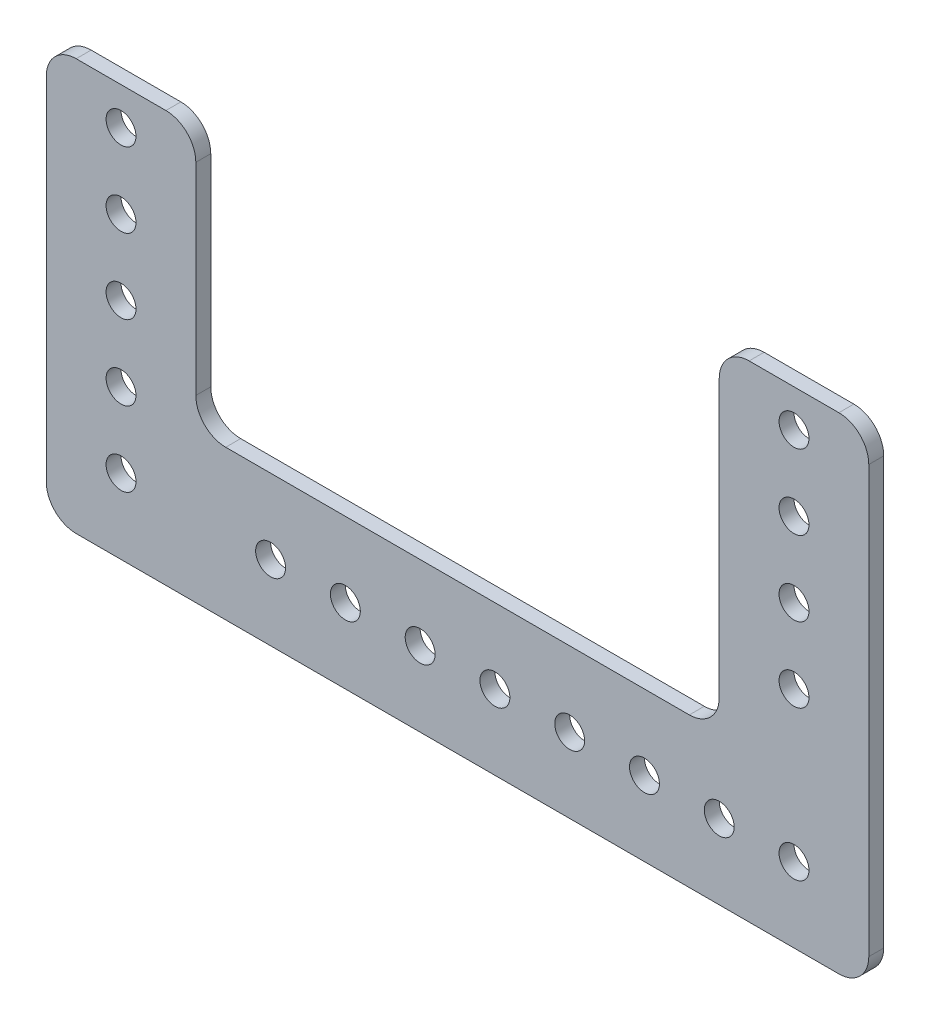
ISO-10303-21;
HEADER;
FILE_DESCRIPTION(('STEP AP214'),'2;1');
FILE_NAME('part.step','',(''),(''),'','','');
FILE_SCHEMA(('AUTOMOTIVE_DESIGN { 1 0 10303 214 1 1 1 1 }'));
ENDSEC;
DATA;
#1=APPLICATION_CONTEXT('core data for automotive mechanical design processes');
#2=APPLICATION_PROTOCOL_DEFINITION('international standard','automotive_design',2000,#1);
#3=PRODUCT_CONTEXT('',#1,'mechanical');
#4=PRODUCT('Part','Part','',(#3));
#5=PRODUCT_RELATED_PRODUCT_CATEGORY('part','',(#4));
#6=PRODUCT_DEFINITION_FORMATION('','',#4);
#7=PRODUCT_DEFINITION_CONTEXT('part definition',#1,'design');
#8=PRODUCT_DEFINITION('design','',#6,#7);
#9=PRODUCT_DEFINITION_SHAPE('','',#8);
#10=(LENGTH_UNIT() NAMED_UNIT(*) SI_UNIT(.MILLI.,.METRE.));
#11=(NAMED_UNIT(*) PLANE_ANGLE_UNIT() SI_UNIT($,.RADIAN.));
#12=(NAMED_UNIT(*) SI_UNIT($,.STERADIAN.) SOLID_ANGLE_UNIT());
#13=UNCERTAINTY_MEASURE_WITH_UNIT(LENGTH_MEASURE(1.E-05),#10,'distance_accuracy_value','');
#14=(GEOMETRIC_REPRESENTATION_CONTEXT(3) GLOBAL_UNCERTAINTY_ASSIGNED_CONTEXT((#13)) GLOBAL_UNIT_ASSIGNED_CONTEXT((#10,
#11,#12)) REPRESENTATION_CONTEXT('',''));
#15=CARTESIAN_POINT('',(0.,0.,0.));
#16=DIRECTION('',(0.,0.,1.));
#17=DIRECTION('',(1.,0.,0.));
#18=AXIS2_PLACEMENT_3D('',#15,#16,#17);
#19=CARTESIAN_POINT('',(452.12,62.23,2.54));
#20=DIRECTION('',(0.,0.,-1.));
#21=DIRECTION('',(-1.,0.,0.));
#22=AXIS2_PLACEMENT_3D('',#19,#20,#21);
#23=PLANE('',#22);
#24=DIRECTION('',(0.,1.,0.));
#25=VECTOR('',#24,1.);
#26=CARTESIAN_POINT('',(457.2,82.55,2.54));
#27=LINE('',#26,#25);
#28=CARTESIAN_POINT('',(457.2,62.23,2.54));
#29=VERTEX_POINT('',#28);
#30=CARTESIAN_POINT('',(457.2,134.62,2.54));
#31=VERTEX_POINT('',#30);
#32=EDGE_CURVE('E116',#29,#31,#27,.T.);
#33=ORIENTED_EDGE('',*,*,#32,.T.);
#34=CARTESIAN_POINT('',(452.12,134.62,2.54));
#35=DIRECTION('',(0.,0.,1.));
#36=DIRECTION('',(-1.,0.,0.));
#37=AXIS2_PLACEMENT_3D('',#34,#35,#36);
#38=CIRCLE('',#37,5.07999999999999);
#39=CARTESIAN_POINT('',(452.12,139.7,2.54));
#40=VERTEX_POINT('',#39);
#41=EDGE_CURVE('E297',#31,#40,#38,.T.);
#42=ORIENTED_EDGE('',*,*,#41,.T.);
#43=DIRECTION('',(-1.,0.,0.));
#44=VECTOR('',#43,1.);
#45=CARTESIAN_POINT('',(436.88,139.7,2.54));
#46=LINE('',#45,#44);
#47=CARTESIAN_POINT('',(436.88,139.7,2.54));
#48=VERTEX_POINT('',#47);
#49=EDGE_CURVE('E248',#40,#48,#46,.T.);
#50=ORIENTED_EDGE('',*,*,#49,.T.);
#51=CARTESIAN_POINT('',(436.88,134.62,2.54));
#52=DIRECTION('',(0.,0.,1.));
#53=DIRECTION('',(-1.,0.,0.));
#54=AXIS2_PLACEMENT_3D('',#51,#52,#53);
#55=CIRCLE('',#54,5.07999999999999);
#56=CARTESIAN_POINT('',(431.8,134.62,2.54));
#57=VERTEX_POINT('',#56);
#58=EDGE_CURVE('E267',#48,#57,#55,.T.);
#59=ORIENTED_EDGE('',*,*,#58,.T.);
#60=DIRECTION('',(0.,-1.,0.));
#61=VECTOR('',#60,1.);
#62=CARTESIAN_POINT('',(431.8,87.6300000000001,2.54));
#63=LINE('',#62,#61);
#64=CARTESIAN_POINT('',(431.8,87.6300000000001,2.54));
#65=VERTEX_POINT('',#64);
#66=EDGE_CURVE('E264',#57,#65,#63,.T.);
#67=ORIENTED_EDGE('',*,*,#66,.T.);
#68=CARTESIAN_POINT('',(426.72,87.63,2.54));
#69=DIRECTION('',(0.,0.,-1.));
#70=DIRECTION('',(1.,0.,0.));
#71=AXIS2_PLACEMENT_3D('',#68,#69,#70);
#72=CIRCLE('',#71,5.07999999999999);
#73=CARTESIAN_POINT('',(426.72,82.55,2.54));
#74=VERTEX_POINT('',#73);
#75=EDGE_CURVE('E266',#65,#74,#72,.T.);
#76=ORIENTED_EDGE('',*,*,#75,.T.);
#77=DIRECTION('',(-1.,0.,0.));
#78=VECTOR('',#77,1.);
#79=CARTESIAN_POINT('',(347.98,82.55,2.54));
#80=LINE('',#79,#78);
#81=CARTESIAN_POINT('',(347.98,82.55,2.54));
#82=VERTEX_POINT('',#81);
#83=EDGE_CURVE('E269',#74,#82,#80,.T.);
#84=ORIENTED_EDGE('',*,*,#83,.T.);
#85=CARTESIAN_POINT('',(347.98,87.63,2.54));
#86=DIRECTION('',(0.,0.,-1.));
#87=DIRECTION('',(1.,0.,0.));
#88=AXIS2_PLACEMENT_3D('',#85,#86,#87);
#89=CIRCLE('',#88,5.07999999999999);
#90=CARTESIAN_POINT('',(342.9,87.6300000000001,2.54));
#91=VERTEX_POINT('',#90);
#92=EDGE_CURVE('E275',#82,#91,#89,.T.);
#93=ORIENTED_EDGE('',*,*,#92,.T.);
#94=DIRECTION('',(0.,1.,0.));
#95=VECTOR('',#94,1.);
#96=CARTESIAN_POINT('',(342.9,121.92,2.54));
#97=LINE('',#96,#95);
#98=CARTESIAN_POINT('',(342.9,121.92,2.54));
#99=VERTEX_POINT('',#98);
#100=EDGE_CURVE('E277',#91,#99,#97,.T.);
#101=ORIENTED_EDGE('',*,*,#100,.T.);
#102=CARTESIAN_POINT('',(337.82,121.92,2.54));
#103=DIRECTION('',(0.,0.,1.));
#104=DIRECTION('',(-1.,0.,0.));
#105=AXIS2_PLACEMENT_3D('',#102,#103,#104);
#106=CIRCLE('',#105,5.07999999999999);
#107=CARTESIAN_POINT('',(337.82,127.,2.54));
#108=VERTEX_POINT('',#107);
#109=EDGE_CURVE('E279',#99,#108,#106,.T.);
#110=ORIENTED_EDGE('',*,*,#109,.T.);
#111=DIRECTION('',(-1.,0.,0.));
#112=VECTOR('',#111,1.);
#113=CARTESIAN_POINT('',(322.58,127.,2.54));
#114=LINE('',#113,#112);
#115=CARTESIAN_POINT('',(322.58,127.,2.54));
#116=VERTEX_POINT('',#115);
#117=EDGE_CURVE('E281',#108,#116,#114,.T.);
#118=ORIENTED_EDGE('',*,*,#117,.T.);
#119=CARTESIAN_POINT('',(322.58,121.92,2.54));
#120=DIRECTION('',(0.,0.,1.));
#121=DIRECTION('',(-1.,0.,0.));
#122=AXIS2_PLACEMENT_3D('',#119,#120,#121);
#123=CIRCLE('',#122,5.07999999999999);
#124=CARTESIAN_POINT('',(317.5,121.92,2.54));
#125=VERTEX_POINT('',#124);
#126=EDGE_CURVE('E283',#116,#125,#123,.T.);
#127=ORIENTED_EDGE('',*,*,#126,.T.);
#128=DIRECTION('',(0.,-1.,0.));
#129=VECTOR('',#128,1.);
#130=CARTESIAN_POINT('',(317.5,62.23,2.54));
#131=LINE('',#130,#129);
#132=CARTESIAN_POINT('',(317.5,62.23,2.54));
#133=VERTEX_POINT('',#132);
#134=EDGE_CURVE('E160',#125,#133,#131,.T.);
#135=ORIENTED_EDGE('',*,*,#134,.T.);
#136=CARTESIAN_POINT('',(322.58,62.23,2.54));
#137=DIRECTION('',(0.,0.,1.));
#138=DIRECTION('',(1.,0.,0.));
#139=AXIS2_PLACEMENT_3D('',#136,#137,#138);
#140=CIRCLE('',#139,5.07999999999999);
#141=CARTESIAN_POINT('',(322.58,57.15,2.54));
#142=VERTEX_POINT('',#141);
#143=EDGE_CURVE('E154',#133,#142,#140,.T.);
#144=ORIENTED_EDGE('',*,*,#143,.T.);
#145=DIRECTION('',(1.,0.,0.));
#146=VECTOR('',#145,1.);
#147=CARTESIAN_POINT('',(452.12,57.15,2.54));
#148=LINE('',#147,#146);
#149=CARTESIAN_POINT('',(452.12,57.15,2.54));
#150=VERTEX_POINT('',#149);
#151=EDGE_CURVE('E158',#142,#150,#148,.T.);
#152=ORIENTED_EDGE('',*,*,#151,.T.);
#153=CARTESIAN_POINT('',(452.12,62.23,2.54));
#154=DIRECTION('',(0.,0.,1.));
#155=DIRECTION('',(-1.,0.,0.));
#156=AXIS2_PLACEMENT_3D('',#153,#154,#155);
#157=CIRCLE('',#156,5.07999999999999);
#158=EDGE_CURVE('E50',#150,#29,#157,.T.);
#159=ORIENTED_EDGE('',*,*,#158,.T.);
#160=EDGE_LOOP('',(#33,#42,#50,#59,#67,#76,#84,#93,#101,#110,#118,#127,#135,#144,#152,#159));
#161=FACE_BOUND('',#160,.T.);
#162=CARTESIAN_POINT('',(444.500000000001,133.35,2.54));
#163=DIRECTION('',(0.,0.,1.));
#164=DIRECTION('',(1.,0.,0.));
#165=AXIS2_PLACEMENT_3D('',#162,#163,#164);
#166=CIRCLE('',#165,2.54000000000001);
#167=CARTESIAN_POINT('',(447.040000000001,133.35,2.54));
#168=VERTEX_POINT('',#167);
#169=EDGE_CURVE('E180',#168,#168,#166,.T.);
#170=ORIENTED_EDGE('',*,*,#169,.F.);
#171=EDGE_LOOP('',(#170));
#172=FACE_BOUND('',#171,.T.);
#173=CARTESIAN_POINT('',(444.500000000001,120.65,2.54));
#174=DIRECTION('',(0.,0.,1.));
#175=DIRECTION('',(1.,0.,0.));
#176=AXIS2_PLACEMENT_3D('',#173,#174,#175);
#177=CIRCLE('',#176,2.54000000000001);
#178=CARTESIAN_POINT('',(447.040000000001,120.65,2.54));
#179=VERTEX_POINT('',#178);
#180=EDGE_CURVE('E728',#179,#179,#177,.T.);
#181=ORIENTED_EDGE('',*,*,#180,.F.);
#182=EDGE_LOOP('',(#181));
#183=FACE_BOUND('',#182,.T.);
#184=CARTESIAN_POINT('',(444.500000000002,107.95,2.54));
#185=DIRECTION('',(0.,0.,1.));
#186=DIRECTION('',(1.,0.,0.));
#187=AXIS2_PLACEMENT_3D('',#184,#185,#186);
#188=CIRCLE('',#187,2.54000000000001);
#189=CARTESIAN_POINT('',(447.040000000002,107.95,2.54));
#190=VERTEX_POINT('',#189);
#191=EDGE_CURVE('E722',#190,#190,#188,.T.);
#192=ORIENTED_EDGE('',*,*,#191,.F.);
#193=EDGE_LOOP('',(#192));
#194=FACE_BOUND('',#193,.T.);
#195=CARTESIAN_POINT('',(444.500000000002,95.25,2.54));
#196=DIRECTION('',(0.,0.,1.));
#197=DIRECTION('',(1.,0.,0.));
#198=AXIS2_PLACEMENT_3D('',#195,#196,#197);
#199=CIRCLE('',#198,2.54000000000001);
#200=CARTESIAN_POINT('',(447.040000000002,95.25,2.54));
#201=VERTEX_POINT('',#200);
#202=EDGE_CURVE('E716',#201,#201,#199,.T.);
#203=ORIENTED_EDGE('',*,*,#202,.F.);
#204=EDGE_LOOP('',(#203));
#205=FACE_BOUND('',#204,.T.);
#206=CARTESIAN_POINT('',(444.5,69.85,2.54));
#207=DIRECTION('',(0.,0.,1.));
#208=DIRECTION('',(1.,0.,0.));
#209=AXIS2_PLACEMENT_3D('',#206,#207,#208);
#210=CIRCLE('',#209,2.54000000000001);
#211=CARTESIAN_POINT('',(447.04,69.85,2.54));
#212=VERTEX_POINT('',#211);
#213=EDGE_CURVE('E710',#212,#212,#210,.T.);
#214=ORIENTED_EDGE('',*,*,#213,.F.);
#215=EDGE_LOOP('',(#214));
#216=FACE_BOUND('',#215,.T.);
#217=CARTESIAN_POINT('',(431.8,69.85,2.54));
#218=DIRECTION('',(0.,0.,1.));
#219=DIRECTION('',(1.,0.,0.));
#220=AXIS2_PLACEMENT_3D('',#217,#218,#219);
#221=CIRCLE('',#220,2.54000000000001);
#222=CARTESIAN_POINT('',(434.34,69.85,2.54));
#223=VERTEX_POINT('',#222);
#224=EDGE_CURVE('E704',#223,#223,#221,.T.);
#225=ORIENTED_EDGE('',*,*,#224,.F.);
#226=EDGE_LOOP('',(#225));
#227=FACE_BOUND('',#226,.T.);
#228=CARTESIAN_POINT('',(419.1,69.85,2.54));
#229=DIRECTION('',(0.,0.,1.));
#230=DIRECTION('',(1.,0.,0.));
#231=AXIS2_PLACEMENT_3D('',#228,#229,#230);
#232=CIRCLE('',#231,2.54000000000001);
#233=CARTESIAN_POINT('',(421.64,69.85,2.54));
#234=VERTEX_POINT('',#233);
#235=EDGE_CURVE('E698',#234,#234,#232,.T.);
#236=ORIENTED_EDGE('',*,*,#235,.F.);
#237=EDGE_LOOP('',(#236));
#238=FACE_BOUND('',#237,.T.);
#239=CARTESIAN_POINT('',(406.4,69.85,2.54));
#240=DIRECTION('',(0.,0.,1.));
#241=DIRECTION('',(1.,0.,0.));
#242=AXIS2_PLACEMENT_3D('',#239,#240,#241);
#243=CIRCLE('',#242,2.54000000000001);
#244=CARTESIAN_POINT('',(408.94,69.85,2.54));
#245=VERTEX_POINT('',#244);
#246=EDGE_CURVE('E692',#245,#245,#243,.T.);
#247=ORIENTED_EDGE('',*,*,#246,.F.);
#248=EDGE_LOOP('',(#247));
#249=FACE_BOUND('',#248,.T.);
#250=CARTESIAN_POINT('',(393.7,69.85,2.54));
#251=DIRECTION('',(0.,0.,1.));
#252=DIRECTION('',(1.,0.,0.));
#253=AXIS2_PLACEMENT_3D('',#250,#251,#252);
#254=CIRCLE('',#253,2.53999999999995);
#255=CARTESIAN_POINT('',(396.24,69.85,2.54));
#256=VERTEX_POINT('',#255);
#257=EDGE_CURVE('E686',#256,#256,#254,.T.);
#258=ORIENTED_EDGE('',*,*,#257,.F.);
#259=EDGE_LOOP('',(#258));
#260=FACE_BOUND('',#259,.T.);
#261=CARTESIAN_POINT('',(381.,69.85,2.54));
#262=DIRECTION('',(0.,0.,1.));
#263=DIRECTION('',(1.,0.,0.));
#264=AXIS2_PLACEMENT_3D('',#261,#262,#263);
#265=CIRCLE('',#264,2.54000000000001);
#266=CARTESIAN_POINT('',(383.54,69.85,2.54));
#267=VERTEX_POINT('',#266);
#268=EDGE_CURVE('E680',#267,#267,#265,.T.);
#269=ORIENTED_EDGE('',*,*,#268,.F.);
#270=EDGE_LOOP('',(#269));
#271=FACE_BOUND('',#270,.T.);
#272=CARTESIAN_POINT('',(368.3,69.85,2.54));
#273=DIRECTION('',(0.,0.,1.));
#274=DIRECTION('',(1.,0.,0.));
#275=AXIS2_PLACEMENT_3D('',#272,#273,#274);
#276=CIRCLE('',#275,2.54000000000001);
#277=CARTESIAN_POINT('',(370.84,69.85,2.54));
#278=VERTEX_POINT('',#277);
#279=EDGE_CURVE('E674',#278,#278,#276,.T.);
#280=ORIENTED_EDGE('',*,*,#279,.F.);
#281=EDGE_LOOP('',(#280));
#282=FACE_BOUND('',#281,.T.);
#283=CARTESIAN_POINT('',(355.6,69.85,2.54));
#284=DIRECTION('',(0.,0.,1.));
#285=DIRECTION('',(1.,0.,0.));
#286=AXIS2_PLACEMENT_3D('',#283,#284,#285);
#287=CIRCLE('',#286,2.54000000000001);
#288=CARTESIAN_POINT('',(358.14,69.85,2.54));
#289=VERTEX_POINT('',#288);
#290=EDGE_CURVE('E668',#289,#289,#287,.T.);
#291=ORIENTED_EDGE('',*,*,#290,.F.);
#292=EDGE_LOOP('',(#291));
#293=FACE_BOUND('',#292,.T.);
#294=CARTESIAN_POINT('',(330.200000000002,69.85,2.54));
#295=DIRECTION('',(0.,0.,1.));
#296=DIRECTION('',(1.,0.,0.));
#297=AXIS2_PLACEMENT_3D('',#294,#295,#296);
#298=CIRCLE('',#297,2.54000000000001);
#299=CARTESIAN_POINT('',(332.740000000002,69.85,2.54));
#300=VERTEX_POINT('',#299);
#301=EDGE_CURVE('E662',#300,#300,#298,.T.);
#302=ORIENTED_EDGE('',*,*,#301,.F.);
#303=EDGE_LOOP('',(#302));
#304=FACE_BOUND('',#303,.T.);
#305=CARTESIAN_POINT('',(330.200000000002,82.55,2.54));
#306=DIRECTION('',(0.,0.,1.));
#307=DIRECTION('',(1.,0.,0.));
#308=AXIS2_PLACEMENT_3D('',#305,#306,#307);
#309=CIRCLE('',#308,2.54000000000001);
#310=CARTESIAN_POINT('',(332.740000000002,82.55,2.54));
#311=VERTEX_POINT('',#310);
#312=EDGE_CURVE('E656',#311,#311,#309,.T.);
#313=ORIENTED_EDGE('',*,*,#312,.F.);
#314=EDGE_LOOP('',(#313));
#315=FACE_BOUND('',#314,.T.);
#316=CARTESIAN_POINT('',(330.200000000002,95.25,2.54));
#317=DIRECTION('',(0.,0.,1.));
#318=DIRECTION('',(1.,0.,0.));
#319=AXIS2_PLACEMENT_3D('',#316,#317,#318);
#320=CIRCLE('',#319,2.54000000000001);
#321=CARTESIAN_POINT('',(332.740000000002,95.25,2.54));
#322=VERTEX_POINT('',#321);
#323=EDGE_CURVE('E650',#322,#322,#320,.T.);
#324=ORIENTED_EDGE('',*,*,#323,.F.);
#325=EDGE_LOOP('',(#324));
#326=FACE_BOUND('',#325,.T.);
#327=CARTESIAN_POINT('',(330.200000000002,107.95,2.54));
#328=DIRECTION('',(0.,0.,1.));
#329=DIRECTION('',(1.,0.,0.));
#330=AXIS2_PLACEMENT_3D('',#327,#328,#329);
#331=CIRCLE('',#330,2.54000000000001);
#332=CARTESIAN_POINT('',(332.740000000002,107.95,2.54));
#333=VERTEX_POINT('',#332);
#334=EDGE_CURVE('E644',#333,#333,#331,.T.);
#335=ORIENTED_EDGE('',*,*,#334,.F.);
#336=EDGE_LOOP('',(#335));
#337=FACE_BOUND('',#336,.T.);
#338=CARTESIAN_POINT('',(330.200000000002,120.65,2.54));
#339=DIRECTION('',(0.,0.,1.));
#340=DIRECTION('',(1.,0.,0.));
#341=AXIS2_PLACEMENT_3D('',#338,#339,#340);
#342=CIRCLE('',#341,2.54000000000001);
#343=CARTESIAN_POINT('',(332.740000000002,120.65,2.54));
#344=VERTEX_POINT('',#343);
#345=EDGE_CURVE('E635',#344,#344,#342,.T.);
#346=ORIENTED_EDGE('',*,*,#345,.F.);
#347=EDGE_LOOP('',(#346));
#348=FACE_BOUND('',#347,.T.);
#349=ADVANCED_FACE('F33',(#161,#172,#183,#194,#205,#216,#227,#238,#249,#260,#271,#282,#293,#304,
#315,#326,#337,#348),#23,.F.);
#350=CARTESIAN_POINT('',(452.12,62.23,0.));
#351=DIRECTION('',(0.,0.,-1.));
#352=DIRECTION('',(-1.,0.,0.));
#353=AXIS2_PLACEMENT_3D('',#350,#351,#352);
#354=PLANE('',#353);
#355=CARTESIAN_POINT('',(330.200000000002,107.95,0.));
#356=DIRECTION('',(0.,0.,1.));
#357=DIRECTION('',(1.,0.,0.));
#358=AXIS2_PLACEMENT_3D('',#355,#356,#357);
#359=CIRCLE('',#358,2.54000000000001);
#360=CARTESIAN_POINT('',(332.740000000002,107.95,0.));
#361=VERTEX_POINT('',#360);
#362=EDGE_CURVE('E641',#361,#361,#359,.T.);
#363=ORIENTED_EDGE('',*,*,#362,.T.);
#364=EDGE_LOOP('',(#363));
#365=FACE_BOUND('',#364,.T.);
#366=CARTESIAN_POINT('',(330.200000000002,82.55,0.));
#367=DIRECTION('',(0.,0.,1.));
#368=DIRECTION('',(1.,0.,0.));
#369=AXIS2_PLACEMENT_3D('',#366,#367,#368);
#370=CIRCLE('',#369,2.54000000000001);
#371=CARTESIAN_POINT('',(332.740000000002,82.55,0.));
#372=VERTEX_POINT('',#371);
#373=EDGE_CURVE('E653',#372,#372,#370,.T.);
#374=ORIENTED_EDGE('',*,*,#373,.T.);
#375=EDGE_LOOP('',(#374));
#376=FACE_BOUND('',#375,.T.);
#377=CARTESIAN_POINT('',(355.6,69.85,0.));
#378=DIRECTION('',(0.,0.,1.));
#379=DIRECTION('',(1.,0.,0.));
#380=AXIS2_PLACEMENT_3D('',#377,#378,#379);
#381=CIRCLE('',#380,2.54000000000001);
#382=CARTESIAN_POINT('',(358.14,69.85,0.));
#383=VERTEX_POINT('',#382);
#384=EDGE_CURVE('E665',#383,#383,#381,.T.);
#385=ORIENTED_EDGE('',*,*,#384,.T.);
#386=EDGE_LOOP('',(#385));
#387=FACE_BOUND('',#386,.T.);
#388=CARTESIAN_POINT('',(381.,69.85,0.));
#389=DIRECTION('',(0.,0.,1.));
#390=DIRECTION('',(1.,0.,0.));
#391=AXIS2_PLACEMENT_3D('',#388,#389,#390);
#392=CIRCLE('',#391,2.54000000000001);
#393=CARTESIAN_POINT('',(383.54,69.85,0.));
#394=VERTEX_POINT('',#393);
#395=EDGE_CURVE('E677',#394,#394,#392,.T.);
#396=ORIENTED_EDGE('',*,*,#395,.T.);
#397=EDGE_LOOP('',(#396));
#398=FACE_BOUND('',#397,.T.);
#399=CARTESIAN_POINT('',(406.4,69.85,0.));
#400=DIRECTION('',(0.,0.,1.));
#401=DIRECTION('',(1.,0.,0.));
#402=AXIS2_PLACEMENT_3D('',#399,#400,#401);
#403=CIRCLE('',#402,2.54000000000001);
#404=CARTESIAN_POINT('',(408.94,69.85,0.));
#405=VERTEX_POINT('',#404);
#406=EDGE_CURVE('E689',#405,#405,#403,.T.);
#407=ORIENTED_EDGE('',*,*,#406,.T.);
#408=EDGE_LOOP('',(#407));
#409=FACE_BOUND('',#408,.T.);
#410=CARTESIAN_POINT('',(431.8,69.85,0.));
#411=DIRECTION('',(0.,0.,1.));
#412=DIRECTION('',(1.,0.,0.));
#413=AXIS2_PLACEMENT_3D('',#410,#411,#412);
#414=CIRCLE('',#413,2.54000000000001);
#415=CARTESIAN_POINT('',(434.34,69.85,0.));
#416=VERTEX_POINT('',#415);
#417=EDGE_CURVE('E701',#416,#416,#414,.T.);
#418=ORIENTED_EDGE('',*,*,#417,.T.);
#419=EDGE_LOOP('',(#418));
#420=FACE_BOUND('',#419,.T.);
#421=CARTESIAN_POINT('',(444.500000000002,95.25,0.));
#422=DIRECTION('',(0.,0.,1.));
#423=DIRECTION('',(1.,0.,0.));
#424=AXIS2_PLACEMENT_3D('',#421,#422,#423);
#425=CIRCLE('',#424,2.54000000000001);
#426=CARTESIAN_POINT('',(447.040000000002,95.25,0.));
#427=VERTEX_POINT('',#426);
#428=EDGE_CURVE('E713',#427,#427,#425,.T.);
#429=ORIENTED_EDGE('',*,*,#428,.T.);
#430=EDGE_LOOP('',(#429));
#431=FACE_BOUND('',#430,.T.);
#432=CARTESIAN_POINT('',(444.500000000001,120.65,0.));
#433=DIRECTION('',(0.,0.,1.));
#434=DIRECTION('',(1.,0.,0.));
#435=AXIS2_PLACEMENT_3D('',#432,#433,#434);
#436=CIRCLE('',#435,2.54000000000001);
#437=CARTESIAN_POINT('',(447.040000000001,120.65,0.));
#438=VERTEX_POINT('',#437);
#439=EDGE_CURVE('E725',#438,#438,#436,.T.);
#440=ORIENTED_EDGE('',*,*,#439,.T.);
#441=EDGE_LOOP('',(#440));
#442=FACE_BOUND('',#441,.T.);
#443=DIRECTION('',(0.,1.,0.));
#444=VECTOR('',#443,1.);
#445=CARTESIAN_POINT('',(457.2,134.62,0.));
#446=LINE('',#445,#444);
#447=CARTESIAN_POINT('',(457.2,62.23,0.));
#448=VERTEX_POINT('',#447);
#449=CARTESIAN_POINT('',(457.2,134.62,0.));
#450=VERTEX_POINT('',#449);
#451=EDGE_CURVE('E110',#448,#450,#446,.T.);
#452=ORIENTED_EDGE('',*,*,#451,.F.);
#453=CARTESIAN_POINT('',(452.12,62.23,0.));
#454=DIRECTION('',(0.,0.,1.));
#455=DIRECTION('',(-1.,0.,0.));
#456=AXIS2_PLACEMENT_3D('',#453,#454,#455);
#457=CIRCLE('',#456,5.07999999999999);
#458=CARTESIAN_POINT('',(452.12,57.15,0.));
#459=VERTEX_POINT('',#458);
#460=EDGE_CURVE('E206',#459,#448,#457,.T.);
#461=ORIENTED_EDGE('',*,*,#460,.F.);
#462=DIRECTION('',(1.,0.,0.));
#463=VECTOR('',#462,1.);
#464=CARTESIAN_POINT('',(452.12,57.15,0.));
#465=LINE('',#464,#463);
#466=CARTESIAN_POINT('',(322.58,57.15,0.));
#467=VERTEX_POINT('',#466);
#468=EDGE_CURVE('E103',#467,#459,#465,.T.);
#469=ORIENTED_EDGE('',*,*,#468,.F.);
#470=CARTESIAN_POINT('',(322.58,62.23,0.));
#471=DIRECTION('',(0.,0.,1.));
#472=DIRECTION('',(1.,0.,0.));
#473=AXIS2_PLACEMENT_3D('',#470,#471,#472);
#474=CIRCLE('',#473,5.07999999999999);
#475=CARTESIAN_POINT('',(317.5,62.23,0.));
#476=VERTEX_POINT('',#475);
#477=EDGE_CURVE('E168',#476,#467,#474,.T.);
#478=ORIENTED_EDGE('',*,*,#477,.F.);
#479=DIRECTION('',(0.,-1.,0.));
#480=VECTOR('',#479,1.);
#481=CARTESIAN_POINT('',(317.5,62.23,0.));
#482=LINE('',#481,#480);
#483=CARTESIAN_POINT('',(317.5,121.92,0.));
#484=VERTEX_POINT('',#483);
#485=EDGE_CURVE('E202',#484,#476,#482,.T.);
#486=ORIENTED_EDGE('',*,*,#485,.F.);
#487=CARTESIAN_POINT('',(322.58,121.92,0.));
#488=DIRECTION('',(0.,0.,1.));
#489=DIRECTION('',(-1.,0.,0.));
#490=AXIS2_PLACEMENT_3D('',#487,#488,#489);
#491=CIRCLE('',#490,5.07999999999999);
#492=CARTESIAN_POINT('',(322.58,127.,0.));
#493=VERTEX_POINT('',#492);
#494=EDGE_CURVE('E200',#493,#484,#491,.T.);
#495=ORIENTED_EDGE('',*,*,#494,.F.);
#496=DIRECTION('',(-1.,0.,0.));
#497=VECTOR('',#496,1.);
#498=CARTESIAN_POINT('',(322.58,127.,0.));
#499=LINE('',#498,#497);
#500=CARTESIAN_POINT('',(337.82,127.,0.));
#501=VERTEX_POINT('',#500);
#502=EDGE_CURVE('E198',#501,#493,#499,.T.);
#503=ORIENTED_EDGE('',*,*,#502,.F.);
#504=CARTESIAN_POINT('',(337.82,121.92,0.));
#505=DIRECTION('',(0.,0.,1.));
#506=DIRECTION('',(-1.,0.,0.));
#507=AXIS2_PLACEMENT_3D('',#504,#505,#506);
#508=CIRCLE('',#507,5.07999999999999);
#509=CARTESIAN_POINT('',(342.9,121.92,0.));
#510=VERTEX_POINT('',#509);
#511=EDGE_CURVE('E196',#510,#501,#508,.T.);
#512=ORIENTED_EDGE('',*,*,#511,.F.);
#513=DIRECTION('',(0.,1.,0.));
#514=VECTOR('',#513,1.);
#515=CARTESIAN_POINT('',(342.9,121.92,0.));
#516=LINE('',#515,#514);
#517=CARTESIAN_POINT('',(342.9,87.6300000000001,0.));
#518=VERTEX_POINT('',#517);
#519=EDGE_CURVE('E194',#518,#510,#516,.T.);
#520=ORIENTED_EDGE('',*,*,#519,.F.);
#521=CARTESIAN_POINT('',(347.98,87.63,0.));
#522=DIRECTION('',(0.,0.,-1.));
#523=DIRECTION('',(1.,0.,0.));
#524=AXIS2_PLACEMENT_3D('',#521,#522,#523);
#525=CIRCLE('',#524,5.07999999999999);
#526=CARTESIAN_POINT('',(347.98,82.55,0.));
#527=VERTEX_POINT('',#526);
#528=EDGE_CURVE('E192',#527,#518,#525,.T.);
#529=ORIENTED_EDGE('',*,*,#528,.F.);
#530=DIRECTION('',(-1.,0.,0.));
#531=VECTOR('',#530,1.);
#532=CARTESIAN_POINT('',(347.98,82.55,0.));
#533=LINE('',#532,#531);
#534=CARTESIAN_POINT('',(426.72,82.55,0.));
#535=VERTEX_POINT('',#534);
#536=EDGE_CURVE('E190',#535,#527,#533,.T.);
#537=ORIENTED_EDGE('',*,*,#536,.F.);
#538=CARTESIAN_POINT('',(426.72,87.63,0.));
#539=DIRECTION('',(0.,0.,-1.));
#540=DIRECTION('',(1.,0.,0.));
#541=AXIS2_PLACEMENT_3D('',#538,#539,#540);
#542=CIRCLE('',#541,5.07999999999999);
#543=CARTESIAN_POINT('',(431.8,87.6300000000001,0.));
#544=VERTEX_POINT('',#543);
#545=EDGE_CURVE('E188',#544,#535,#542,.T.);
#546=ORIENTED_EDGE('',*,*,#545,.F.);
#547=DIRECTION('',(0.,-1.,0.));
#548=VECTOR('',#547,1.);
#549=CARTESIAN_POINT('',(431.8,87.6300000000001,0.));
#550=LINE('',#549,#548);
#551=CARTESIAN_POINT('',(431.8,134.62,0.));
#552=VERTEX_POINT('',#551);
#553=EDGE_CURVE('E186',#552,#544,#550,.T.);
#554=ORIENTED_EDGE('',*,*,#553,.F.);
#555=CARTESIAN_POINT('',(436.88,134.62,0.));
#556=DIRECTION('',(0.,0.,1.));
#557=DIRECTION('',(-1.,0.,0.));
#558=AXIS2_PLACEMENT_3D('',#555,#556,#557);
#559=CIRCLE('',#558,5.07999999999999);
#560=CARTESIAN_POINT('',(436.88,139.7,0.));
#561=VERTEX_POINT('',#560);
#562=EDGE_CURVE('E184',#561,#552,#559,.T.);
#563=ORIENTED_EDGE('',*,*,#562,.F.);
#564=DIRECTION('',(-1.,0.,0.));
#565=VECTOR('',#564,1.);
#566=CARTESIAN_POINT('',(436.88,139.7,0.));
#567=LINE('',#566,#565);
#568=CARTESIAN_POINT('',(452.12,139.7,0.));
#569=VERTEX_POINT('',#568);
#570=EDGE_CURVE('E182',#569,#561,#567,.T.);
#571=ORIENTED_EDGE('',*,*,#570,.F.);
#572=CARTESIAN_POINT('',(452.12,134.62,0.));
#573=DIRECTION('',(0.,0.,1.));
#574=DIRECTION('',(-1.,0.,0.));
#575=AXIS2_PLACEMENT_3D('',#572,#573,#574);
#576=CIRCLE('',#575,5.07999999999999);
#577=EDGE_CURVE('E179',#450,#569,#576,.T.);
#578=ORIENTED_EDGE('',*,*,#577,.F.);
#579=EDGE_LOOP('',(#452,#461,#469,#478,#486,#495,#503,#512,#520,#529,#537,#546,#554,#563,#571,#578));
#580=FACE_BOUND('',#579,.T.);
#581=CARTESIAN_POINT('',(444.500000000001,133.35,0.));
#582=DIRECTION('',(0.,0.,1.));
#583=DIRECTION('',(1.,0.,0.));
#584=AXIS2_PLACEMENT_3D('',#581,#582,#583);
#585=CIRCLE('',#584,2.54000000000001);
#586=CARTESIAN_POINT('',(447.040000000001,133.35,0.));
#587=VERTEX_POINT('',#586);
#588=EDGE_CURVE('E301',#587,#587,#585,.T.);
#589=ORIENTED_EDGE('',*,*,#588,.T.);
#590=EDGE_LOOP('',(#589));
#591=FACE_BOUND('',#590,.T.);
#592=CARTESIAN_POINT('',(444.500000000002,107.95,0.));
#593=DIRECTION('',(0.,0.,1.));
#594=DIRECTION('',(1.,0.,0.));
#595=AXIS2_PLACEMENT_3D('',#592,#593,#594);
#596=CIRCLE('',#595,2.54000000000001);
#597=CARTESIAN_POINT('',(447.040000000002,107.95,0.));
#598=VERTEX_POINT('',#597);
#599=EDGE_CURVE('E719',#598,#598,#596,.T.);
#600=ORIENTED_EDGE('',*,*,#599,.T.);
#601=EDGE_LOOP('',(#600));
#602=FACE_BOUND('',#601,.T.);
#603=CARTESIAN_POINT('',(444.5,69.85,0.));
#604=DIRECTION('',(0.,0.,1.));
#605=DIRECTION('',(1.,0.,0.));
#606=AXIS2_PLACEMENT_3D('',#603,#604,#605);
#607=CIRCLE('',#606,2.54000000000001);
#608=CARTESIAN_POINT('',(447.04,69.85,0.));
#609=VERTEX_POINT('',#608);
#610=EDGE_CURVE('E707',#609,#609,#607,.T.);
#611=ORIENTED_EDGE('',*,*,#610,.T.);
#612=EDGE_LOOP('',(#611));
#613=FACE_BOUND('',#612,.T.);
#614=CARTESIAN_POINT('',(419.1,69.85,0.));
#615=DIRECTION('',(0.,0.,1.));
#616=DIRECTION('',(1.,0.,0.));
#617=AXIS2_PLACEMENT_3D('',#614,#615,#616);
#618=CIRCLE('',#617,2.54000000000001);
#619=CARTESIAN_POINT('',(421.64,69.85,0.));
#620=VERTEX_POINT('',#619);
#621=EDGE_CURVE('E695',#620,#620,#618,.T.);
#622=ORIENTED_EDGE('',*,*,#621,.T.);
#623=EDGE_LOOP('',(#622));
#624=FACE_BOUND('',#623,.T.);
#625=CARTESIAN_POINT('',(393.7,69.85,0.));
#626=DIRECTION('',(0.,0.,1.));
#627=DIRECTION('',(1.,0.,0.));
#628=AXIS2_PLACEMENT_3D('',#625,#626,#627);
#629=CIRCLE('',#628,2.53999999999995);
#630=CARTESIAN_POINT('',(396.24,69.85,0.));
#631=VERTEX_POINT('',#630);
#632=EDGE_CURVE('E683',#631,#631,#629,.T.);
#633=ORIENTED_EDGE('',*,*,#632,.T.);
#634=EDGE_LOOP('',(#633));
#635=FACE_BOUND('',#634,.T.);
#636=CARTESIAN_POINT('',(368.3,69.85,0.));
#637=DIRECTION('',(0.,0.,1.));
#638=DIRECTION('',(1.,0.,0.));
#639=AXIS2_PLACEMENT_3D('',#636,#637,#638);
#640=CIRCLE('',#639,2.54000000000001);
#641=CARTESIAN_POINT('',(370.84,69.85,0.));
#642=VERTEX_POINT('',#641);
#643=EDGE_CURVE('E671',#642,#642,#640,.T.);
#644=ORIENTED_EDGE('',*,*,#643,.T.);
#645=EDGE_LOOP('',(#644));
#646=FACE_BOUND('',#645,.T.);
#647=CARTESIAN_POINT('',(330.200000000002,69.85,0.));
#648=DIRECTION('',(0.,0.,1.));
#649=DIRECTION('',(1.,0.,0.));
#650=AXIS2_PLACEMENT_3D('',#647,#648,#649);
#651=CIRCLE('',#650,2.54000000000001);
#652=CARTESIAN_POINT('',(332.740000000002,69.85,0.));
#653=VERTEX_POINT('',#652);
#654=EDGE_CURVE('E659',#653,#653,#651,.T.);
#655=ORIENTED_EDGE('',*,*,#654,.T.);
#656=EDGE_LOOP('',(#655));
#657=FACE_BOUND('',#656,.T.);
#658=CARTESIAN_POINT('',(330.200000000002,95.25,0.));
#659=DIRECTION('',(0.,0.,1.));
#660=DIRECTION('',(1.,0.,0.));
#661=AXIS2_PLACEMENT_3D('',#658,#659,#660);
#662=CIRCLE('',#661,2.54000000000001);
#663=CARTESIAN_POINT('',(332.740000000002,95.25,0.));
#664=VERTEX_POINT('',#663);
#665=EDGE_CURVE('E647',#664,#664,#662,.T.);
#666=ORIENTED_EDGE('',*,*,#665,.T.);
#667=EDGE_LOOP('',(#666));
#668=FACE_BOUND('',#667,.T.);
#669=CARTESIAN_POINT('',(330.200000000002,120.65,0.));
#670=DIRECTION('',(0.,0.,1.));
#671=DIRECTION('',(1.,0.,0.));
#672=AXIS2_PLACEMENT_3D('',#669,#670,#671);
#673=CIRCLE('',#672,2.54000000000001);
#674=CARTESIAN_POINT('',(332.740000000002,120.65,0.));
#675=VERTEX_POINT('',#674);
#676=EDGE_CURVE('E638',#675,#675,#673,.T.);
#677=ORIENTED_EDGE('',*,*,#676,.T.);
#678=EDGE_LOOP('',(#677));
#679=FACE_BOUND('',#678,.T.);
#680=ADVANCED_FACE('F252',(#365,#376,#387,#398,#409,#420,#431,#442,#580,#591,#602,#613,#624,
#635,#646,#657,#668,#679),#354,.T.);
#681=CARTESIAN_POINT('',(457.2,134.62,2.54));
#682=DIRECTION('',(-1.,0.,0.));
#683=DIRECTION('',(0.,0.,1.));
#684=AXIS2_PLACEMENT_3D('',#681,#682,#683);
#685=PLANE('',#684);
#686=ORIENTED_EDGE('',*,*,#451,.T.);
#687=DIRECTION('',(0.,0.,-1.));
#688=VECTOR('',#687,1.);
#689=CARTESIAN_POINT('',(457.2,134.62,2.54));
#690=LINE('',#689,#688);
#691=EDGE_CURVE('E11',#31,#450,#690,.T.);
#692=ORIENTED_EDGE('',*,*,#691,.F.);
#693=ORIENTED_EDGE('',*,*,#32,.F.);
#694=DIRECTION('',(0.,0.,-1.));
#695=VECTOR('',#694,1.);
#696=CARTESIAN_POINT('',(457.2,62.23,2.54));
#697=LINE('',#696,#695);
#698=EDGE_CURVE('E174',#29,#448,#697,.T.);
#699=ORIENTED_EDGE('',*,*,#698,.T.);
#700=EDGE_LOOP('',(#686,#692,#693,#699));
#701=FACE_BOUND('',#700,.T.);
#702=ADVANCED_FACE('F35',(#701),#685,.F.);
#703=CARTESIAN_POINT('',(452.12,134.62,2.54));
#704=DIRECTION('',(0.,0.,-1.));
#705=DIRECTION('',(-1.,0.,0.));
#706=AXIS2_PLACEMENT_3D('',#703,#704,#705);
#707=CYLINDRICAL_SURFACE('',#706,5.07999999999999);
#708=ORIENTED_EDGE('',*,*,#577,.T.);
#709=DIRECTION('',(0.,0.,-1.));
#710=VECTOR('',#709,1.);
#711=CARTESIAN_POINT('',(452.12,139.7,2.54));
#712=LINE('',#711,#710);
#713=EDGE_CURVE('E42',#40,#569,#712,.T.);
#714=ORIENTED_EDGE('',*,*,#713,.F.);
#715=ORIENTED_EDGE('',*,*,#41,.F.);
#716=ORIENTED_EDGE('',*,*,#691,.T.);
#717=EDGE_LOOP('',(#708,#714,#715,#716));
#718=FACE_BOUND('',#717,.T.);
#719=ADVANCED_FACE('F303',(#718),#707,.T.);
#720=CARTESIAN_POINT('',(436.88,139.7,2.54));
#721=DIRECTION('',(0.,-1.,0.));
#722=DIRECTION('',(0.,0.,-1.));
#723=AXIS2_PLACEMENT_3D('',#720,#721,#722);
#724=PLANE('',#723);
#725=ORIENTED_EDGE('',*,*,#570,.T.);
#726=DIRECTION('',(0.,0.,-1.));
#727=VECTOR('',#726,1.);
#728=CARTESIAN_POINT('',(436.88,139.7,2.54));
#729=LINE('',#728,#727);
#730=EDGE_CURVE('E239',#48,#561,#729,.T.);
#731=ORIENTED_EDGE('',*,*,#730,.F.);
#732=ORIENTED_EDGE('',*,*,#49,.F.);
#733=ORIENTED_EDGE('',*,*,#713,.T.);
#734=EDGE_LOOP('',(#725,#731,#732,#733));
#735=FACE_BOUND('',#734,.T.);
#736=ADVANCED_FACE('F246',(#735),#724,.F.);
#737=CARTESIAN_POINT('',(436.88,134.62,2.54));
#738=DIRECTION('',(0.,0.,-1.));
#739=DIRECTION('',(-1.,0.,0.));
#740=AXIS2_PLACEMENT_3D('',#737,#738,#739);
#741=CYLINDRICAL_SURFACE('',#740,5.07999999999999);
#742=ORIENTED_EDGE('',*,*,#562,.T.);
#743=DIRECTION('',(0.,0.,-1.));
#744=VECTOR('',#743,1.);
#745=CARTESIAN_POINT('',(431.8,134.62,2.54));
#746=LINE('',#745,#744);
#747=EDGE_CURVE('E236',#57,#552,#746,.T.);
#748=ORIENTED_EDGE('',*,*,#747,.F.);
#749=ORIENTED_EDGE('',*,*,#58,.F.);
#750=ORIENTED_EDGE('',*,*,#730,.T.);
#751=EDGE_LOOP('',(#742,#748,#749,#750));
#752=FACE_BOUND('',#751,.T.);
#753=ADVANCED_FACE('F258',(#752),#741,.T.);
#754=CARTESIAN_POINT('',(431.8,87.6300000000001,2.54));
#755=DIRECTION('',(1.,0.,0.));
#756=DIRECTION('',(0.,0.,-1.));
#757=AXIS2_PLACEMENT_3D('',#754,#755,#756);
#758=PLANE('',#757);
#759=ORIENTED_EDGE('',*,*,#553,.T.);
#760=DIRECTION('',(0.,0.,-1.));
#761=VECTOR('',#760,1.);
#762=CARTESIAN_POINT('',(431.8,87.6300000000001,2.54));
#763=LINE('',#762,#761);
#764=EDGE_CURVE('E233',#65,#544,#763,.T.);
#765=ORIENTED_EDGE('',*,*,#764,.F.);
#766=ORIENTED_EDGE('',*,*,#66,.F.);
#767=ORIENTED_EDGE('',*,*,#747,.T.);
#768=EDGE_LOOP('',(#759,#765,#766,#767));
#769=FACE_BOUND('',#768,.T.);
#770=ADVANCED_FACE('F262',(#769),#758,.F.);
#771=CARTESIAN_POINT('',(426.72,87.63,2.54));
#772=DIRECTION('',(0.,0.,-1.));
#773=DIRECTION('',(-1.,0.,0.));
#774=AXIS2_PLACEMENT_3D('',#771,#772,#773);
#775=CYLINDRICAL_SURFACE('',#774,5.07999999999999);
#776=ORIENTED_EDGE('',*,*,#545,.T.);
#777=DIRECTION('',(0.,0.,-1.));
#778=VECTOR('',#777,1.);
#779=CARTESIAN_POINT('',(426.72,82.55,2.54));
#780=LINE('',#779,#778);
#781=EDGE_CURVE('E230',#74,#535,#780,.T.);
#782=ORIENTED_EDGE('',*,*,#781,.F.);
#783=ORIENTED_EDGE('',*,*,#75,.F.);
#784=ORIENTED_EDGE('',*,*,#764,.T.);
#785=EDGE_LOOP('',(#776,#782,#783,#784));
#786=FACE_BOUND('',#785,.T.);
#787=ADVANCED_FACE('F350',(#786),#775,.F.);
#788=CARTESIAN_POINT('',(347.98,82.55,2.54));
#789=DIRECTION('',(0.,-1.,0.));
#790=DIRECTION('',(0.,0.,-1.));
#791=AXIS2_PLACEMENT_3D('',#788,#789,#790);
#792=PLANE('',#791);
#793=ORIENTED_EDGE('',*,*,#536,.T.);
#794=DIRECTION('',(0.,0.,-1.));
#795=VECTOR('',#794,1.);
#796=CARTESIAN_POINT('',(347.98,82.55,2.54));
#797=LINE('',#796,#795);
#798=EDGE_CURVE('E227',#82,#527,#797,.T.);
#799=ORIENTED_EDGE('',*,*,#798,.F.);
#800=ORIENTED_EDGE('',*,*,#83,.F.);
#801=ORIENTED_EDGE('',*,*,#781,.T.);
#802=EDGE_LOOP('',(#793,#799,#800,#801));
#803=FACE_BOUND('',#802,.T.);
#804=ADVANCED_FACE('F346',(#803),#792,.F.);
#805=CARTESIAN_POINT('',(347.98,87.63,2.54));
#806=DIRECTION('',(0.,0.,-1.));
#807=DIRECTION('',(-1.,0.,0.));
#808=AXIS2_PLACEMENT_3D('',#805,#806,#807);
#809=CYLINDRICAL_SURFACE('',#808,5.07999999999999);
#810=ORIENTED_EDGE('',*,*,#528,.T.);
#811=DIRECTION('',(0.,0.,-1.));
#812=VECTOR('',#811,1.);
#813=CARTESIAN_POINT('',(342.9,87.6300000000001,2.54));
#814=LINE('',#813,#812);
#815=EDGE_CURVE('E224',#91,#518,#814,.T.);
#816=ORIENTED_EDGE('',*,*,#815,.F.);
#817=ORIENTED_EDGE('',*,*,#92,.F.);
#818=ORIENTED_EDGE('',*,*,#798,.T.);
#819=EDGE_LOOP('',(#810,#816,#817,#818));
#820=FACE_BOUND('',#819,.T.);
#821=ADVANCED_FACE('F342',(#820),#809,.F.);
#822=CARTESIAN_POINT('',(342.9,121.92,2.54));
#823=DIRECTION('',(-1.,0.,0.));
#824=DIRECTION('',(0.,0.,1.));
#825=AXIS2_PLACEMENT_3D('',#822,#823,#824);
#826=PLANE('',#825);
#827=ORIENTED_EDGE('',*,*,#519,.T.);
#828=DIRECTION('',(0.,0.,-1.));
#829=VECTOR('',#828,1.);
#830=CARTESIAN_POINT('',(342.9,121.92,2.54));
#831=LINE('',#830,#829);
#832=EDGE_CURVE('E221',#99,#510,#831,.T.);
#833=ORIENTED_EDGE('',*,*,#832,.F.);
#834=ORIENTED_EDGE('',*,*,#100,.F.);
#835=ORIENTED_EDGE('',*,*,#815,.T.);
#836=EDGE_LOOP('',(#827,#833,#834,#835));
#837=FACE_BOUND('',#836,.T.);
#838=ADVANCED_FACE('F338',(#837),#826,.F.);
#839=CARTESIAN_POINT('',(337.82,121.92,2.54));
#840=DIRECTION('',(0.,0.,-1.));
#841=DIRECTION('',(-1.,0.,0.));
#842=AXIS2_PLACEMENT_3D('',#839,#840,#841);
#843=CYLINDRICAL_SURFACE('',#842,5.07999999999999);
#844=ORIENTED_EDGE('',*,*,#511,.T.);
#845=DIRECTION('',(0.,0.,-1.));
#846=VECTOR('',#845,1.);
#847=CARTESIAN_POINT('',(337.82,127.,2.54));
#848=LINE('',#847,#846);
#849=EDGE_CURVE('E218',#108,#501,#848,.T.);
#850=ORIENTED_EDGE('',*,*,#849,.F.);
#851=ORIENTED_EDGE('',*,*,#109,.F.);
#852=ORIENTED_EDGE('',*,*,#832,.T.);
#853=EDGE_LOOP('',(#844,#850,#851,#852));
#854=FACE_BOUND('',#853,.T.);
#855=ADVANCED_FACE('F334',(#854),#843,.T.);
#856=CARTESIAN_POINT('',(322.58,127.,2.54));
#857=DIRECTION('',(0.,-1.,0.));
#858=DIRECTION('',(0.,0.,-1.));
#859=AXIS2_PLACEMENT_3D('',#856,#857,#858);
#860=PLANE('',#859);
#861=ORIENTED_EDGE('',*,*,#502,.T.);
#862=DIRECTION('',(0.,0.,-1.));
#863=VECTOR('',#862,1.);
#864=CARTESIAN_POINT('',(322.58,127.,2.54));
#865=LINE('',#864,#863);
#866=EDGE_CURVE('E215',#116,#493,#865,.T.);
#867=ORIENTED_EDGE('',*,*,#866,.F.);
#868=ORIENTED_EDGE('',*,*,#117,.F.);
#869=ORIENTED_EDGE('',*,*,#849,.T.);
#870=EDGE_LOOP('',(#861,#867,#868,#869));
#871=FACE_BOUND('',#870,.T.);
#872=ADVANCED_FACE('F331',(#871),#860,.F.);
#873=CARTESIAN_POINT('',(322.58,121.92,2.54));
#874=DIRECTION('',(0.,0.,-1.));
#875=DIRECTION('',(-1.,0.,0.));
#876=AXIS2_PLACEMENT_3D('',#873,#874,#875);
#877=CYLINDRICAL_SURFACE('',#876,5.07999999999999);
#878=ORIENTED_EDGE('',*,*,#494,.T.);
#879=DIRECTION('',(0.,0.,-1.));
#880=VECTOR('',#879,1.);
#881=CARTESIAN_POINT('',(317.5,121.92,2.54));
#882=LINE('',#881,#880);
#883=EDGE_CURVE('E212',#125,#484,#882,.T.);
#884=ORIENTED_EDGE('',*,*,#883,.F.);
#885=ORIENTED_EDGE('',*,*,#126,.F.);
#886=ORIENTED_EDGE('',*,*,#866,.T.);
#887=EDGE_LOOP('',(#878,#884,#885,#886));
#888=FACE_BOUND('',#887,.T.);
#889=ADVANCED_FACE('F289',(#888),#877,.T.);
#890=CARTESIAN_POINT('',(317.5,62.23,2.54));
#891=DIRECTION('',(1.,0.,0.));
#892=DIRECTION('',(0.,0.,-1.));
#893=AXIS2_PLACEMENT_3D('',#890,#891,#892);
#894=PLANE('',#893);
#895=ORIENTED_EDGE('',*,*,#485,.T.);
#896=DIRECTION('',(0.,0.,-1.));
#897=VECTOR('',#896,1.);
#898=CARTESIAN_POINT('',(317.5,62.23,2.54));
#899=LINE('',#898,#897);
#900=EDGE_CURVE('E169',#133,#476,#899,.T.);
#901=ORIENTED_EDGE('',*,*,#900,.F.);
#902=ORIENTED_EDGE('',*,*,#134,.F.);
#903=ORIENTED_EDGE('',*,*,#883,.T.);
#904=EDGE_LOOP('',(#895,#901,#902,#903));
#905=FACE_BOUND('',#904,.T.);
#906=ADVANCED_FACE('F293',(#905),#894,.F.);
#907=CARTESIAN_POINT('',(322.58,62.23,2.54));
#908=DIRECTION('',(0.,0.,-1.));
#909=DIRECTION('',(-1.,0.,0.));
#910=AXIS2_PLACEMENT_3D('',#907,#908,#909);
#911=CYLINDRICAL_SURFACE('',#910,5.07999999999999);
#912=ORIENTED_EDGE('',*,*,#477,.T.);
#913=DIRECTION('',(0.,0.,-1.));
#914=VECTOR('',#913,1.);
#915=CARTESIAN_POINT('',(322.58,57.15,2.54));
#916=LINE('',#915,#914);
#917=EDGE_CURVE('E165',#142,#467,#916,.T.);
#918=ORIENTED_EDGE('',*,*,#917,.F.);
#919=ORIENTED_EDGE('',*,*,#143,.F.);
#920=ORIENTED_EDGE('',*,*,#900,.T.);
#921=EDGE_LOOP('',(#912,#918,#919,#920));
#922=FACE_BOUND('',#921,.T.);
#923=ADVANCED_FACE('F166',(#922),#911,.T.);
#924=CARTESIAN_POINT('',(452.12,57.15,2.54));
#925=DIRECTION('',(0.,1.,0.));
#926=DIRECTION('',(0.,0.,1.));
#927=AXIS2_PLACEMENT_3D('',#924,#925,#926);
#928=PLANE('',#927);
#929=ORIENTED_EDGE('',*,*,#468,.T.);
#930=DIRECTION('',(0.,0.,-1.));
#931=VECTOR('',#930,1.);
#932=CARTESIAN_POINT('',(452.12,57.15,2.54));
#933=LINE('',#932,#931);
#934=EDGE_CURVE('E170',#150,#459,#933,.T.);
#935=ORIENTED_EDGE('',*,*,#934,.F.);
#936=ORIENTED_EDGE('',*,*,#151,.F.);
#937=ORIENTED_EDGE('',*,*,#917,.T.);
#938=EDGE_LOOP('',(#929,#935,#936,#937));
#939=FACE_BOUND('',#938,.T.);
#940=ADVANCED_FACE('F172',(#939),#928,.F.);
#941=CARTESIAN_POINT('',(452.12,62.23,2.54));
#942=DIRECTION('',(0.,0.,-1.));
#943=DIRECTION('',(-1.,0.,0.));
#944=AXIS2_PLACEMENT_3D('',#941,#942,#943);
#945=CYLINDRICAL_SURFACE('',#944,5.07999999999999);
#946=ORIENTED_EDGE('',*,*,#460,.T.);
#947=ORIENTED_EDGE('',*,*,#698,.F.);
#948=ORIENTED_EDGE('',*,*,#158,.F.);
#949=ORIENTED_EDGE('',*,*,#934,.T.);
#950=EDGE_LOOP('',(#946,#947,#948,#949));
#951=FACE_BOUND('',#950,.T.);
#952=ADVANCED_FACE('F295',(#951),#945,.T.);
#953=CARTESIAN_POINT('',(444.500000000001,133.35,2.54));
#954=DIRECTION('',(0.,0.,-1.));
#955=DIRECTION('',(-1.,0.,0.));
#956=AXIS2_PLACEMENT_3D('',#953,#954,#955);
#957=CYLINDRICAL_SURFACE('',#956,2.54000000000001);
#958=ORIENTED_EDGE('',*,*,#169,.T.);
#959=EDGE_LOOP('',(#958));
#960=FACE_BOUND('',#959,.T.);
#961=ORIENTED_EDGE('',*,*,#588,.F.);
#962=EDGE_LOOP('',(#961));
#963=FACE_BOUND('',#962,.T.);
#964=ADVANCED_FACE('F318',(#960,#963),#957,.F.);
#965=CARTESIAN_POINT('',(444.500000000001,120.65,2.54));
#966=DIRECTION('',(0.,0.,-1.));
#967=DIRECTION('',(-1.,0.,0.));
#968=AXIS2_PLACEMENT_3D('',#965,#966,#967);
#969=CYLINDRICAL_SURFACE('',#968,2.54000000000001);
#970=ORIENTED_EDGE('',*,*,#180,.T.);
#971=EDGE_LOOP('',(#970));
#972=FACE_BOUND('',#971,.T.);
#973=ORIENTED_EDGE('',*,*,#439,.F.);
#974=EDGE_LOOP('',(#973));
#975=FACE_BOUND('',#974,.T.);
#976=ADVANCED_FACE('F416',(#972,#975),#969,.F.);
#977=CARTESIAN_POINT('',(444.500000000002,107.95,2.54));
#978=DIRECTION('',(0.,0.,-1.));
#979=DIRECTION('',(-1.,0.,0.));
#980=AXIS2_PLACEMENT_3D('',#977,#978,#979);
#981=CYLINDRICAL_SURFACE('',#980,2.54000000000001);
#982=ORIENTED_EDGE('',*,*,#191,.T.);
#983=EDGE_LOOP('',(#982));
#984=FACE_BOUND('',#983,.T.);
#985=ORIENTED_EDGE('',*,*,#599,.F.);
#986=EDGE_LOOP('',(#985));
#987=FACE_BOUND('',#986,.T.);
#988=ADVANCED_FACE('F423',(#984,#987),#981,.F.);
#989=CARTESIAN_POINT('',(444.500000000002,95.25,2.54));
#990=DIRECTION('',(0.,0.,-1.));
#991=DIRECTION('',(-1.,0.,0.));
#992=AXIS2_PLACEMENT_3D('',#989,#990,#991);
#993=CYLINDRICAL_SURFACE('',#992,2.54000000000001);
#994=ORIENTED_EDGE('',*,*,#202,.T.);
#995=EDGE_LOOP('',(#994));
#996=FACE_BOUND('',#995,.T.);
#997=ORIENTED_EDGE('',*,*,#428,.F.);
#998=EDGE_LOOP('',(#997));
#999=FACE_BOUND('',#998,.T.);
#1000=ADVANCED_FACE('F430',(#996,#999),#993,.F.);
#1001=CARTESIAN_POINT('',(444.5,69.85,2.54));
#1002=DIRECTION('',(0.,0.,-1.));
#1003=DIRECTION('',(-1.,0.,0.));
#1004=AXIS2_PLACEMENT_3D('',#1001,#1002,#1003);
#1005=CYLINDRICAL_SURFACE('',#1004,2.54000000000001);
#1006=ORIENTED_EDGE('',*,*,#213,.T.);
#1007=EDGE_LOOP('',(#1006));
#1008=FACE_BOUND('',#1007,.T.);
#1009=ORIENTED_EDGE('',*,*,#610,.F.);
#1010=EDGE_LOOP('',(#1009));
#1011=FACE_BOUND('',#1010,.T.);
#1012=ADVANCED_FACE('F438',(#1008,#1011),#1005,.F.);
#1013=CARTESIAN_POINT('',(431.8,69.85,2.54));
#1014=DIRECTION('',(0.,0.,-1.));
#1015=DIRECTION('',(-1.,0.,0.));
#1016=AXIS2_PLACEMENT_3D('',#1013,#1014,#1015);
#1017=CYLINDRICAL_SURFACE('',#1016,2.54000000000001);
#1018=ORIENTED_EDGE('',*,*,#224,.T.);
#1019=EDGE_LOOP('',(#1018));
#1020=FACE_BOUND('',#1019,.T.);
#1021=ORIENTED_EDGE('',*,*,#417,.F.);
#1022=EDGE_LOOP('',(#1021));
#1023=FACE_BOUND('',#1022,.T.);
#1024=ADVANCED_FACE('F446',(#1020,#1023),#1017,.F.);
#1025=CARTESIAN_POINT('',(419.1,69.85,2.54));
#1026=DIRECTION('',(0.,0.,-1.));
#1027=DIRECTION('',(-1.,0.,0.));
#1028=AXIS2_PLACEMENT_3D('',#1025,#1026,#1027);
#1029=CYLINDRICAL_SURFACE('',#1028,2.54000000000001);
#1030=ORIENTED_EDGE('',*,*,#235,.T.);
#1031=EDGE_LOOP('',(#1030));
#1032=FACE_BOUND('',#1031,.T.);
#1033=ORIENTED_EDGE('',*,*,#621,.F.);
#1034=EDGE_LOOP('',(#1033));
#1035=FACE_BOUND('',#1034,.T.);
#1036=ADVANCED_FACE('F454',(#1032,#1035),#1029,.F.);
#1037=CARTESIAN_POINT('',(406.4,69.85,2.54));
#1038=DIRECTION('',(0.,0.,-1.));
#1039=DIRECTION('',(-1.,0.,0.));
#1040=AXIS2_PLACEMENT_3D('',#1037,#1038,#1039);
#1041=CYLINDRICAL_SURFACE('',#1040,2.54000000000001);
#1042=ORIENTED_EDGE('',*,*,#246,.T.);
#1043=EDGE_LOOP('',(#1042));
#1044=FACE_BOUND('',#1043,.T.);
#1045=ORIENTED_EDGE('',*,*,#406,.F.);
#1046=EDGE_LOOP('',(#1045));
#1047=FACE_BOUND('',#1046,.T.);
#1048=ADVANCED_FACE('F462',(#1044,#1047),#1041,.F.);
#1049=CARTESIAN_POINT('',(393.7,69.85,2.54));
#1050=DIRECTION('',(0.,0.,-1.));
#1051=DIRECTION('',(-1.,0.,0.));
#1052=AXIS2_PLACEMENT_3D('',#1049,#1050,#1051);
#1053=CYLINDRICAL_SURFACE('',#1052,2.53999999999995);
#1054=ORIENTED_EDGE('',*,*,#257,.T.);
#1055=EDGE_LOOP('',(#1054));
#1056=FACE_BOUND('',#1055,.T.);
#1057=ORIENTED_EDGE('',*,*,#632,.F.);
#1058=EDGE_LOOP('',(#1057));
#1059=FACE_BOUND('',#1058,.T.);
#1060=ADVANCED_FACE('F470',(#1056,#1059),#1053,.F.);
#1061=CARTESIAN_POINT('',(381.,69.85,2.54));
#1062=DIRECTION('',(0.,0.,-1.));
#1063=DIRECTION('',(-1.,0.,0.));
#1064=AXIS2_PLACEMENT_3D('',#1061,#1062,#1063);
#1065=CYLINDRICAL_SURFACE('',#1064,2.54000000000001);
#1066=ORIENTED_EDGE('',*,*,#268,.T.);
#1067=EDGE_LOOP('',(#1066));
#1068=FACE_BOUND('',#1067,.T.);
#1069=ORIENTED_EDGE('',*,*,#395,.F.);
#1070=EDGE_LOOP('',(#1069));
#1071=FACE_BOUND('',#1070,.T.);
#1072=ADVANCED_FACE('F478',(#1068,#1071),#1065,.F.);
#1073=CARTESIAN_POINT('',(368.3,69.85,2.54));
#1074=DIRECTION('',(0.,0.,-1.));
#1075=DIRECTION('',(-1.,0.,0.));
#1076=AXIS2_PLACEMENT_3D('',#1073,#1074,#1075);
#1077=CYLINDRICAL_SURFACE('',#1076,2.54000000000001);
#1078=ORIENTED_EDGE('',*,*,#279,.T.);
#1079=EDGE_LOOP('',(#1078));
#1080=FACE_BOUND('',#1079,.T.);
#1081=ORIENTED_EDGE('',*,*,#643,.F.);
#1082=EDGE_LOOP('',(#1081));
#1083=FACE_BOUND('',#1082,.T.);
#1084=ADVANCED_FACE('F486',(#1080,#1083),#1077,.F.);
#1085=CARTESIAN_POINT('',(355.6,69.85,2.54));
#1086=DIRECTION('',(0.,0.,-1.));
#1087=DIRECTION('',(-1.,0.,0.));
#1088=AXIS2_PLACEMENT_3D('',#1085,#1086,#1087);
#1089=CYLINDRICAL_SURFACE('',#1088,2.54000000000001);
#1090=ORIENTED_EDGE('',*,*,#290,.T.);
#1091=EDGE_LOOP('',(#1090));
#1092=FACE_BOUND('',#1091,.T.);
#1093=ORIENTED_EDGE('',*,*,#384,.F.);
#1094=EDGE_LOOP('',(#1093));
#1095=FACE_BOUND('',#1094,.T.);
#1096=ADVANCED_FACE('F494',(#1092,#1095),#1089,.F.);
#1097=CARTESIAN_POINT('',(330.200000000002,69.85,2.54));
#1098=DIRECTION('',(0.,0.,-1.));
#1099=DIRECTION('',(-1.,0.,0.));
#1100=AXIS2_PLACEMENT_3D('',#1097,#1098,#1099);
#1101=CYLINDRICAL_SURFACE('',#1100,2.54000000000001);
#1102=ORIENTED_EDGE('',*,*,#301,.T.);
#1103=EDGE_LOOP('',(#1102));
#1104=FACE_BOUND('',#1103,.T.);
#1105=ORIENTED_EDGE('',*,*,#654,.F.);
#1106=EDGE_LOOP('',(#1105));
#1107=FACE_BOUND('',#1106,.T.);
#1108=ADVANCED_FACE('F502',(#1104,#1107),#1101,.F.);
#1109=CARTESIAN_POINT('',(330.200000000002,82.55,2.54));
#1110=DIRECTION('',(0.,0.,-1.));
#1111=DIRECTION('',(-1.,0.,0.));
#1112=AXIS2_PLACEMENT_3D('',#1109,#1110,#1111);
#1113=CYLINDRICAL_SURFACE('',#1112,2.54000000000001);
#1114=ORIENTED_EDGE('',*,*,#312,.T.);
#1115=EDGE_LOOP('',(#1114));
#1116=FACE_BOUND('',#1115,.T.);
#1117=ORIENTED_EDGE('',*,*,#373,.F.);
#1118=EDGE_LOOP('',(#1117));
#1119=FACE_BOUND('',#1118,.T.);
#1120=ADVANCED_FACE('F510',(#1116,#1119),#1113,.F.);
#1121=CARTESIAN_POINT('',(330.200000000002,95.25,2.54));
#1122=DIRECTION('',(0.,0.,-1.));
#1123=DIRECTION('',(-1.,0.,0.));
#1124=AXIS2_PLACEMENT_3D('',#1121,#1122,#1123);
#1125=CYLINDRICAL_SURFACE('',#1124,2.54000000000001);
#1126=ORIENTED_EDGE('',*,*,#323,.T.);
#1127=EDGE_LOOP('',(#1126));
#1128=FACE_BOUND('',#1127,.T.);
#1129=ORIENTED_EDGE('',*,*,#665,.F.);
#1130=EDGE_LOOP('',(#1129));
#1131=FACE_BOUND('',#1130,.T.);
#1132=ADVANCED_FACE('F518',(#1128,#1131),#1125,.F.);
#1133=CARTESIAN_POINT('',(330.200000000002,107.95,2.54));
#1134=DIRECTION('',(0.,0.,-1.));
#1135=DIRECTION('',(-1.,0.,0.));
#1136=AXIS2_PLACEMENT_3D('',#1133,#1134,#1135);
#1137=CYLINDRICAL_SURFACE('',#1136,2.54000000000001);
#1138=ORIENTED_EDGE('',*,*,#334,.T.);
#1139=EDGE_LOOP('',(#1138));
#1140=FACE_BOUND('',#1139,.T.);
#1141=ORIENTED_EDGE('',*,*,#362,.F.);
#1142=EDGE_LOOP('',(#1141));
#1143=FACE_BOUND('',#1142,.T.);
#1144=ADVANCED_FACE('F526',(#1140,#1143),#1137,.F.);
#1145=CARTESIAN_POINT('',(330.200000000002,120.65,2.54));
#1146=DIRECTION('',(0.,0.,-1.));
#1147=DIRECTION('',(-1.,0.,0.));
#1148=AXIS2_PLACEMENT_3D('',#1145,#1146,#1147);
#1149=CYLINDRICAL_SURFACE('',#1148,2.54000000000001);
#1150=ORIENTED_EDGE('',*,*,#345,.T.);
#1151=EDGE_LOOP('',(#1150));
#1152=FACE_BOUND('',#1151,.T.);
#1153=ORIENTED_EDGE('',*,*,#676,.F.);
#1154=EDGE_LOOP('',(#1153));
#1155=FACE_BOUND('',#1154,.T.);
#1156=ADVANCED_FACE('F534',(#1152,#1155),#1149,.F.);
#1157=CLOSED_SHELL('',(#349,#680,#702,#719,#736,#753,#770,#787,#804,#821,#838,#855,#872,#889,
#906,#923,#940,#952,#964,#976,#988,#1000,#1012,#1024,#1036,#1048,#1060,#1072,#1084,#1096,#1108,
#1120,#1132,#1144,#1156));
#1158=MANIFOLD_SOLID_BREP('B2',#1157);
#1159=ADVANCED_BREP_SHAPE_REPRESENTATION('',(#18,#1158),#14);
#1160=SHAPE_DEFINITION_REPRESENTATION(#9,#1159);
ENDSEC;
END-ISO-10303-21;
